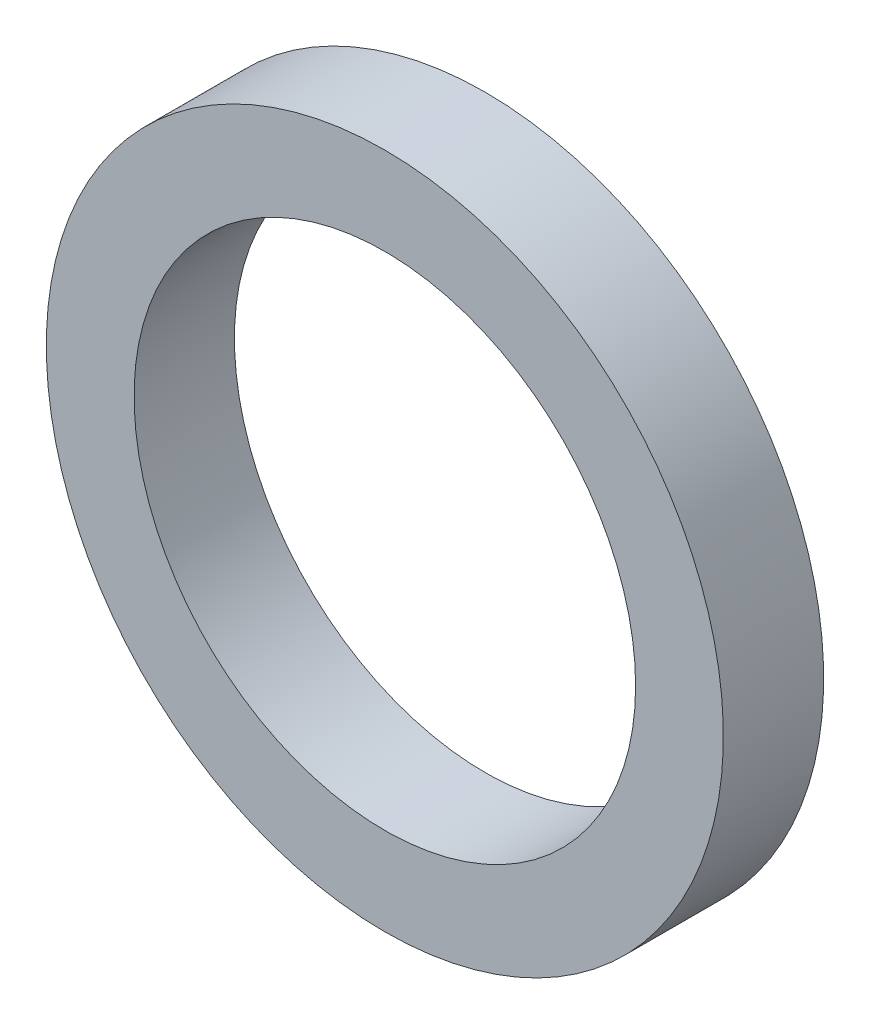
ISO-10303-21;
HEADER;
FILE_DESCRIPTION(('STEP AP214'),'2;1');
FILE_NAME('part.step','',(''),(''),'','','');
FILE_SCHEMA(('AUTOMOTIVE_DESIGN { 1 0 10303 214 1 1 1 1 }'));
ENDSEC;
DATA;
#1=APPLICATION_CONTEXT('core data for automotive mechanical design processes');
#2=APPLICATION_PROTOCOL_DEFINITION('international standard','automotive_design',2000,#1);
#3=PRODUCT_CONTEXT('',#1,'mechanical');
#4=PRODUCT('Part','Part','',(#3));
#5=PRODUCT_RELATED_PRODUCT_CATEGORY('part','',(#4));
#6=PRODUCT_DEFINITION_FORMATION('','',#4);
#7=PRODUCT_DEFINITION_CONTEXT('part definition',#1,'design');
#8=PRODUCT_DEFINITION('design','',#6,#7);
#9=PRODUCT_DEFINITION_SHAPE('','',#8);
#10=(LENGTH_UNIT() NAMED_UNIT(*) SI_UNIT(.MILLI.,.METRE.));
#11=(NAMED_UNIT(*) PLANE_ANGLE_UNIT() SI_UNIT($,.RADIAN.));
#12=(NAMED_UNIT(*) SI_UNIT($,.STERADIAN.) SOLID_ANGLE_UNIT());
#13=UNCERTAINTY_MEASURE_WITH_UNIT(LENGTH_MEASURE(1.E-05),#10,'distance_accuracy_value','');
#14=(GEOMETRIC_REPRESENTATION_CONTEXT(3) GLOBAL_UNCERTAINTY_ASSIGNED_CONTEXT((#13)) GLOBAL_UNIT_ASSIGNED_CONTEXT((#10,
#11,#12)) REPRESENTATION_CONTEXT('',''));
#15=CARTESIAN_POINT('',(0.,0.,0.));
#16=DIRECTION('',(0.,0.,1.));
#17=DIRECTION('',(1.,0.,0.));
#18=AXIS2_PLACEMENT_3D('',#15,#16,#17);
#19=CARTESIAN_POINT('',(0.,0.,4.));
#20=DIRECTION('',(0.,0.,1.));
#21=DIRECTION('',(1.,0.,0.));
#22=AXIS2_PLACEMENT_3D('',#19,#20,#21);
#23=PLANE('',#22);
#24=CARTESIAN_POINT('',(0.,0.,4.));
#25=DIRECTION('',(0.,0.,1.));
#26=DIRECTION('',(0.,1.,0.));
#27=AXIS2_PLACEMENT_3D('',#24,#25,#26);
#28=CIRCLE('',#27,13.5);
#29=CARTESIAN_POINT('',(0.,13.5,4.));
#30=VERTEX_POINT('',#29);
#31=EDGE_CURVE('E11',#30,#30,#28,.T.);
#32=ORIENTED_EDGE('',*,*,#31,.T.);
#33=EDGE_LOOP('',(#32));
#34=FACE_BOUND('',#33,.T.);
#35=CARTESIAN_POINT('',(0.,0.,4.));
#36=DIRECTION('',(0.,0.,1.));
#37=DIRECTION('',(1.,0.,0.));
#38=AXIS2_PLACEMENT_3D('',#35,#36,#37);
#39=CIRCLE('',#38,10.);
#40=CARTESIAN_POINT('',(10.,0.,4.));
#41=VERTEX_POINT('',#40);
#42=EDGE_CURVE('E62',#41,#41,#39,.T.);
#43=ORIENTED_EDGE('',*,*,#42,.F.);
#44=EDGE_LOOP('',(#43));
#45=FACE_BOUND('',#44,.T.);
#46=ADVANCED_FACE('F49',(#34,#45),#23,.T.);
#47=CARTESIAN_POINT('',(0.,0.,0.));
#48=DIRECTION('',(0.,0.,1.));
#49=DIRECTION('',(1.,0.,0.));
#50=AXIS2_PLACEMENT_3D('',#47,#48,#49);
#51=PLANE('',#50);
#52=CARTESIAN_POINT('',(0.,0.,0.));
#53=DIRECTION('',(0.,0.,1.));
#54=DIRECTION('',(0.,1.,0.));
#55=AXIS2_PLACEMENT_3D('',#52,#53,#54);
#56=CIRCLE('',#55,13.5);
#57=CARTESIAN_POINT('',(0.,13.5,0.));
#58=VERTEX_POINT('',#57);
#59=EDGE_CURVE('E53',#58,#58,#56,.T.);
#60=ORIENTED_EDGE('',*,*,#59,.F.);
#61=EDGE_LOOP('',(#60));
#62=FACE_BOUND('',#61,.T.);
#63=CARTESIAN_POINT('',(0.,0.,0.));
#64=DIRECTION('',(0.,0.,1.));
#65=DIRECTION('',(1.,0.,0.));
#66=AXIS2_PLACEMENT_3D('',#63,#64,#65);
#67=CIRCLE('',#66,10.);
#68=CARTESIAN_POINT('',(10.,0.,0.));
#69=VERTEX_POINT('',#68);
#70=EDGE_CURVE('E64',#69,#69,#67,.T.);
#71=ORIENTED_EDGE('',*,*,#70,.T.);
#72=EDGE_LOOP('',(#71));
#73=FACE_BOUND('',#72,.T.);
#74=ADVANCED_FACE('F76',(#62,#73),#51,.F.);
#75=CARTESIAN_POINT('',(0.,0.,4.));
#76=DIRECTION('',(0.,0.,-1.));
#77=DIRECTION('',(-1.,0.,0.));
#78=AXIS2_PLACEMENT_3D('',#75,#76,#77);
#79=CYLINDRICAL_SURFACE('',#78,13.5);
#80=ORIENTED_EDGE('',*,*,#31,.F.);
#81=EDGE_LOOP('',(#80));
#82=FACE_BOUND('',#81,.T.);
#83=ORIENTED_EDGE('',*,*,#59,.T.);
#84=EDGE_LOOP('',(#83));
#85=FACE_BOUND('',#84,.T.);
#86=ADVANCED_FACE('F51',(#82,#85),#79,.T.);
#87=CARTESIAN_POINT('',(0.,0.,4.));
#88=DIRECTION('',(0.,0.,-1.));
#89=DIRECTION('',(-1.,0.,0.));
#90=AXIS2_PLACEMENT_3D('',#87,#88,#89);
#91=CYLINDRICAL_SURFACE('',#90,10.);
#92=ORIENTED_EDGE('',*,*,#42,.T.);
#93=EDGE_LOOP('',(#92));
#94=FACE_BOUND('',#93,.T.);
#95=ORIENTED_EDGE('',*,*,#70,.F.);
#96=EDGE_LOOP('',(#95));
#97=FACE_BOUND('',#96,.T.);
#98=ADVANCED_FACE('F72',(#94,#97),#91,.F.);
#99=CLOSED_SHELL('',(#46,#74,#86,#98));
#100=MANIFOLD_SOLID_BREP('B2',#99);
#101=ADVANCED_BREP_SHAPE_REPRESENTATION('',(#18,#100),#14);
#102=SHAPE_DEFINITION_REPRESENTATION(#9,#101);
ENDSEC;
END-ISO-10303-21;
